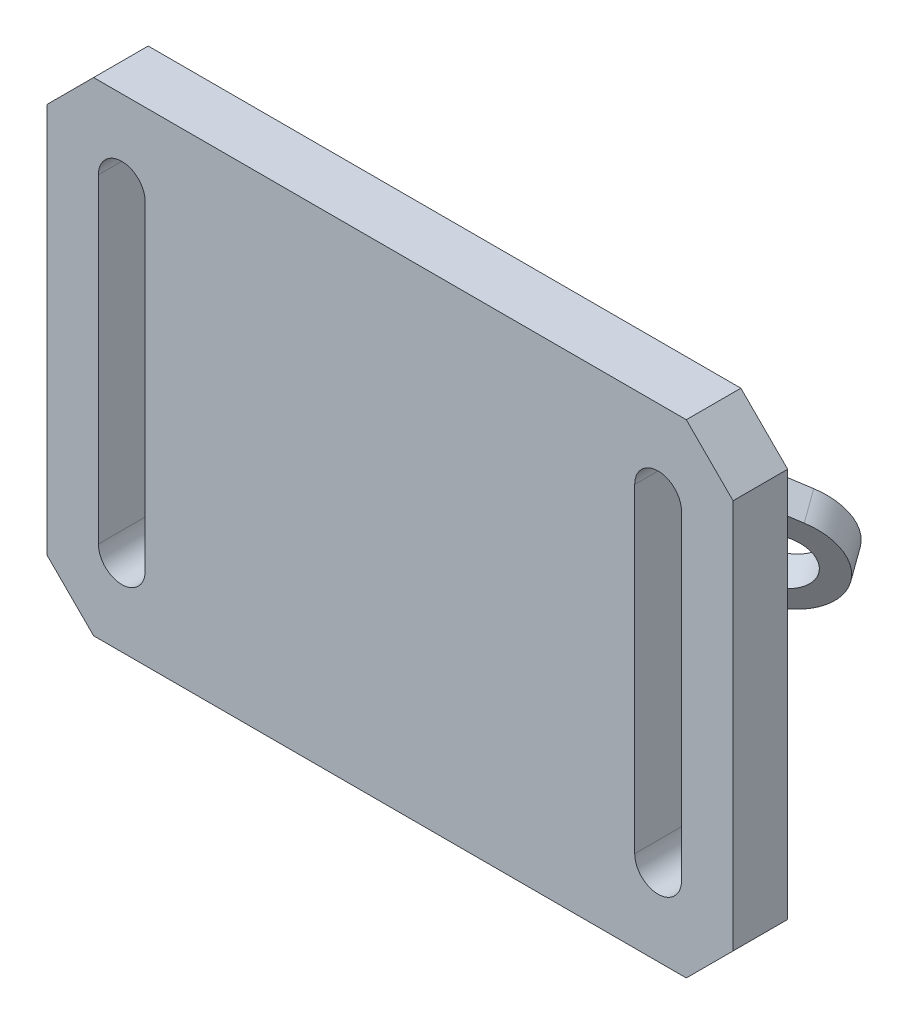
ISO-10303-21;
HEADER;
FILE_DESCRIPTION(('STEP AP214'),'2;1');
FILE_NAME('part.step','',(''),(''),'','','');
FILE_SCHEMA(('AUTOMOTIVE_DESIGN { 1 0 10303 214 1 1 1 1 }'));
ENDSEC;
DATA;
#1=APPLICATION_CONTEXT('core data for automotive mechanical design processes');
#2=APPLICATION_PROTOCOL_DEFINITION('international standard','automotive_design',2000,#1);
#3=PRODUCT_CONTEXT('',#1,'mechanical');
#4=PRODUCT('Part','Part','',(#3));
#5=PRODUCT_RELATED_PRODUCT_CATEGORY('part','',(#4));
#6=PRODUCT_DEFINITION_FORMATION('','',#4);
#7=PRODUCT_DEFINITION_CONTEXT('part definition',#1,'design');
#8=PRODUCT_DEFINITION('design','',#6,#7);
#9=PRODUCT_DEFINITION_SHAPE('','',#8);
#10=(LENGTH_UNIT() NAMED_UNIT(*) SI_UNIT(.MILLI.,.METRE.));
#11=(NAMED_UNIT(*) PLANE_ANGLE_UNIT() SI_UNIT($,.RADIAN.));
#12=(NAMED_UNIT(*) SI_UNIT($,.STERADIAN.) SOLID_ANGLE_UNIT());
#13=UNCERTAINTY_MEASURE_WITH_UNIT(LENGTH_MEASURE(1.E-05),#10,'distance_accuracy_value','');
#14=(GEOMETRIC_REPRESENTATION_CONTEXT(3) GLOBAL_UNCERTAINTY_ASSIGNED_CONTEXT((#13)) GLOBAL_UNIT_ASSIGNED_CONTEXT((#10,
#11,#12)) REPRESENTATION_CONTEXT('',''));
#15=CARTESIAN_POINT('',(0.,0.,0.));
#16=DIRECTION('',(0.,0.,1.));
#17=DIRECTION('',(1.,0.,0.));
#18=AXIS2_PLACEMENT_3D('',#15,#16,#17);
#19=CARTESIAN_POINT('',(0.,0.,0.));
#20=DIRECTION('',(0.,0.,-1.));
#21=DIRECTION('',(-1.,0.,0.));
#22=AXIS2_PLACEMENT_3D('',#19,#20,#21);
#23=PLANE('',#22);
#24=DIRECTION('',(-1.,0.,0.));
#25=VECTOR('',#24,1.);
#26=CARTESIAN_POINT('',(-38.,31.,0.));
#27=LINE('',#26,#25);
#28=CARTESIAN_POINT('',(38.,31.,0.));
#29=VERTEX_POINT('',#28);
#30=CARTESIAN_POINT('',(-38.,31.,0.));
#31=VERTEX_POINT('',#30);
#32=EDGE_CURVE('E329',#29,#31,#27,.T.);
#33=ORIENTED_EDGE('',*,*,#32,.F.);
#34=DIRECTION('',(-0.70710678118655,0.707106781186545,0.));
#35=VECTOR('',#34,1.);
#36=CARTESIAN_POINT('',(38.,31.,0.));
#37=LINE('',#36,#35);
#38=CARTESIAN_POINT('',(44.,25.,0.));
#39=VERTEX_POINT('',#38);
#40=EDGE_CURVE('E335',#39,#29,#37,.T.);
#41=ORIENTED_EDGE('',*,*,#40,.F.);
#42=DIRECTION('',(0.,1.,0.));
#43=VECTOR('',#42,1.);
#44=CARTESIAN_POINT('',(44.,25.,0.));
#45=LINE('',#44,#43);
#46=CARTESIAN_POINT('',(44.,-25.,0.));
#47=VERTEX_POINT('',#46);
#48=EDGE_CURVE('E375',#47,#39,#45,.T.);
#49=ORIENTED_EDGE('',*,*,#48,.F.);
#50=DIRECTION('',(0.707106781186549,0.707106781186546,0.));
#51=VECTOR('',#50,1.);
#52=CARTESIAN_POINT('',(38.,-31.,0.));
#53=LINE('',#52,#51);
#54=CARTESIAN_POINT('',(38.,-31.,0.));
#55=VERTEX_POINT('',#54);
#56=EDGE_CURVE('E372',#55,#47,#53,.T.);
#57=ORIENTED_EDGE('',*,*,#56,.F.);
#58=DIRECTION('',(1.,0.,0.));
#59=VECTOR('',#58,1.);
#60=CARTESIAN_POINT('',(-38.,-31.,0.));
#61=LINE('',#60,#59);
#62=CARTESIAN_POINT('',(-38.,-31.,0.));
#63=VERTEX_POINT('',#62);
#64=EDGE_CURVE('E369',#63,#55,#61,.T.);
#65=ORIENTED_EDGE('',*,*,#64,.F.);
#66=DIRECTION('',(0.707106781186545,-0.70710678118655,0.));
#67=VECTOR('',#66,1.);
#68=CARTESIAN_POINT('',(-44.,-25.,0.));
#69=LINE('',#68,#67);
#70=CARTESIAN_POINT('',(-44.,-25.,0.));
#71=VERTEX_POINT('',#70);
#72=EDGE_CURVE('E366',#71,#63,#69,.T.);
#73=ORIENTED_EDGE('',*,*,#72,.F.);
#74=DIRECTION('',(0.,-1.,0.));
#75=VECTOR('',#74,1.);
#76=CARTESIAN_POINT('',(-44.,25.,0.));
#77=LINE('',#76,#75);
#78=CARTESIAN_POINT('',(-44.,25.,0.));
#79=VERTEX_POINT('',#78);
#80=EDGE_CURVE('E363',#79,#71,#77,.T.);
#81=ORIENTED_EDGE('',*,*,#80,.F.);
#82=DIRECTION('',(-0.707106781186549,-0.707106781186546,0.));
#83=VECTOR('',#82,1.);
#84=CARTESIAN_POINT('',(-44.,25.,0.));
#85=LINE('',#84,#83);
#86=EDGE_CURVE('E360',#31,#79,#85,.T.);
#87=ORIENTED_EDGE('',*,*,#86,.F.);
#88=EDGE_LOOP('',(#33,#41,#49,#57,#65,#73,#81,#87));
#89=FACE_BOUND('',#88,.T.);
#90=DIRECTION('',(0.,1.,0.));
#91=VECTOR('',#90,1.);
#92=CARTESIAN_POINT('',(-31.3856217223385,20.5,0.));
#93=LINE('',#92,#91);
#94=CARTESIAN_POINT('',(-31.3856217223385,-20.5,0.));
#95=VERTEX_POINT('',#94);
#96=CARTESIAN_POINT('',(-31.3856217223385,20.5,0.));
#97=VERTEX_POINT('',#96);
#98=EDGE_CURVE('E291',#95,#97,#93,.T.);
#99=ORIENTED_EDGE('',*,*,#98,.T.);
#100=CARTESIAN_POINT('',(-34.3856217223385,20.5,0.));
#101=DIRECTION('',(0.,0.,1.));
#102=DIRECTION('',(1.,0.,0.));
#103=AXIS2_PLACEMENT_3D('',#100,#101,#102);
#104=CIRCLE('',#103,3.);
#105=CARTESIAN_POINT('',(-37.3856217223385,20.5,0.));
#106=VERTEX_POINT('',#105);
#107=EDGE_CURVE('E286',#97,#106,#104,.T.);
#108=ORIENTED_EDGE('',*,*,#107,.T.);
#109=DIRECTION('',(0.,-1.,0.));
#110=VECTOR('',#109,1.);
#111=CARTESIAN_POINT('',(-37.3856217223385,20.5,0.));
#112=LINE('',#111,#110);
#113=CARTESIAN_POINT('',(-37.3856217223385,-20.5,0.));
#114=VERTEX_POINT('',#113);
#115=EDGE_CURVE('E305',#106,#114,#112,.T.);
#116=ORIENTED_EDGE('',*,*,#115,.T.);
#117=CARTESIAN_POINT('',(-34.3856217223385,-20.5,0.));
#118=DIRECTION('',(0.,0.,1.));
#119=DIRECTION('',(1.,0.,0.));
#120=AXIS2_PLACEMENT_3D('',#117,#118,#119);
#121=CIRCLE('',#120,3.);
#122=EDGE_CURVE('E309',#114,#95,#121,.T.);
#123=ORIENTED_EDGE('',*,*,#122,.T.);
#124=EDGE_LOOP('',(#99,#108,#116,#123));
#125=FACE_BOUND('',#124,.T.);
#126=DIRECTION('',(0.,1.,0.));
#127=VECTOR('',#126,1.);
#128=CARTESIAN_POINT('',(37.3856217223385,20.5,0.));
#129=LINE('',#128,#127);
#130=CARTESIAN_POINT('',(37.3856217223385,-20.5,0.));
#131=VERTEX_POINT('',#130);
#132=CARTESIAN_POINT('',(37.3856217223385,20.5,0.));
#133=VERTEX_POINT('',#132);
#134=EDGE_CURVE('E248',#131,#133,#129,.T.);
#135=ORIENTED_EDGE('',*,*,#134,.T.);
#136=CARTESIAN_POINT('',(34.3856217223385,20.5,0.));
#137=DIRECTION('',(0.,0.,1.));
#138=DIRECTION('',(-1.,0.,0.));
#139=AXIS2_PLACEMENT_3D('',#136,#137,#138);
#140=CIRCLE('',#139,3.);
#141=CARTESIAN_POINT('',(31.3856217223385,20.5,0.));
#142=VERTEX_POINT('',#141);
#143=EDGE_CURVE('E213',#133,#142,#140,.T.);
#144=ORIENTED_EDGE('',*,*,#143,.T.);
#145=DIRECTION('',(0.,-1.,0.));
#146=VECTOR('',#145,1.);
#147=CARTESIAN_POINT('',(31.3856217223385,20.5,0.));
#148=LINE('',#147,#146);
#149=CARTESIAN_POINT('',(31.3856217223385,-20.5,0.));
#150=VERTEX_POINT('',#149);
#151=EDGE_CURVE('E262',#142,#150,#148,.T.);
#152=ORIENTED_EDGE('',*,*,#151,.T.);
#153=CARTESIAN_POINT('',(34.3856217223385,-20.5,0.));
#154=DIRECTION('',(0.,0.,1.));
#155=DIRECTION('',(-1.,0.,0.));
#156=AXIS2_PLACEMENT_3D('',#153,#154,#155);
#157=CIRCLE('',#156,3.);
#158=EDGE_CURVE('E266',#150,#131,#157,.T.);
#159=ORIENTED_EDGE('',*,*,#158,.T.);
#160=EDGE_LOOP('',(#135,#144,#152,#159));
#161=FACE_BOUND('',#160,.T.);
#162=DIRECTION('',(0.51208074849044,0.858937312628501,0.));
#163=VECTOR('',#162,1.);
#164=CARTESIAN_POINT('',(8.69832080368733,-13.3353650602396,0.));
#165=LINE('',#164,#163);
#166=CARTESIAN_POINT('',(8.69832080368733,-13.3353650602396,0.));
#167=VERTEX_POINT('',#166);
#168=CARTESIAN_POINT('',(15.8674512825535,-1.31024268344056,0.));
#169=VERTEX_POINT('',#168);
#170=EDGE_CURVE('E214',#167,#169,#165,.T.);
#171=ORIENTED_EDGE('',*,*,#170,.T.);
#172=DIRECTION('',(-0.8589373126285,0.51208074849044,0.));
#173=VECTOR('',#172,1.);
#174=CARTESIAN_POINT('',(-13.6223102303354,16.2709462185907,0.));
#175=LINE('',#174,#173);
#176=CARTESIAN_POINT('',(-13.6223102303354,16.2709462185907,0.));
#177=VERTEX_POINT('',#176);
#178=EDGE_CURVE('E235',#169,#177,#175,.T.);
#179=ORIENTED_EDGE('',*,*,#178,.T.);
#180=DIRECTION('',(0.51208074849044,0.858937312628501,0.));
#181=VECTOR('',#180,1.);
#182=CARTESIAN_POINT('',(-20.7914407092016,4.24582384179169,0.));
#183=LINE('',#182,#181);
#184=CARTESIAN_POINT('',(-20.7914407092016,4.24582384179169,0.));
#185=VERTEX_POINT('',#184);
#186=EDGE_CURVE('E223',#185,#177,#183,.T.);
#187=ORIENTED_EDGE('',*,*,#186,.F.);
#188=DIRECTION('',(-0.8589373126285,0.51208074849044,0.));
#189=VECTOR('',#188,1.);
#190=CARTESIAN_POINT('',(-20.7914407092016,4.24582384179169,0.));
#191=LINE('',#190,#189);
#192=EDGE_CURVE('E220',#167,#185,#191,.T.);
#193=ORIENTED_EDGE('',*,*,#192,.F.);
#194=EDGE_LOOP('',(#171,#179,#187,#193));
#195=FACE_BOUND('',#194,.T.);
#196=ADVANCED_FACE('F45',(#89,#125,#161,#195),#23,.T.);
#197=CARTESIAN_POINT('',(0.,0.,7.));
#198=DIRECTION('',(0.,0.,-1.));
#199=DIRECTION('',(-1.,0.,0.));
#200=AXIS2_PLACEMENT_3D('',#197,#198,#199);
#201=PLANE('',#200);
#202=CARTESIAN_POINT('',(-34.3856217223385,20.5,7.));
#203=DIRECTION('',(0.,0.,1.));
#204=DIRECTION('',(1.,0.,0.));
#205=AXIS2_PLACEMENT_3D('',#202,#203,#204);
#206=CIRCLE('',#205,3.);
#207=CARTESIAN_POINT('',(-31.3856217223385,20.5,7.));
#208=VERTEX_POINT('',#207);
#209=CARTESIAN_POINT('',(-37.3856217223385,20.5,7.));
#210=VERTEX_POINT('',#209);
#211=EDGE_CURVE('E287',#208,#210,#206,.T.);
#212=ORIENTED_EDGE('',*,*,#211,.F.);
#213=DIRECTION('',(0.,1.,0.));
#214=VECTOR('',#213,1.);
#215=CARTESIAN_POINT('',(-31.3856217223385,20.5,7.));
#216=LINE('',#215,#214);
#217=CARTESIAN_POINT('',(-31.3856217223385,-20.5,7.));
#218=VERTEX_POINT('',#217);
#219=EDGE_CURVE('E298',#218,#208,#216,.T.);
#220=ORIENTED_EDGE('',*,*,#219,.F.);
#221=CARTESIAN_POINT('',(-34.3856217223385,-20.5,7.));
#222=DIRECTION('',(0.,0.,1.));
#223=DIRECTION('',(1.,0.,0.));
#224=AXIS2_PLACEMENT_3D('',#221,#222,#223);
#225=CIRCLE('',#224,3.);
#226=CARTESIAN_POINT('',(-37.3856217223385,-20.5,7.));
#227=VERTEX_POINT('',#226);
#228=EDGE_CURVE('E294',#227,#218,#225,.T.);
#229=ORIENTED_EDGE('',*,*,#228,.F.);
#230=DIRECTION('',(0.,-1.,0.));
#231=VECTOR('',#230,1.);
#232=CARTESIAN_POINT('',(-37.3856217223385,20.5,7.));
#233=LINE('',#232,#231);
#234=EDGE_CURVE('E290',#210,#227,#233,.T.);
#235=ORIENTED_EDGE('',*,*,#234,.F.);
#236=EDGE_LOOP('',(#212,#220,#229,#235));
#237=FACE_BOUND('',#236,.T.);
#238=DIRECTION('',(-1.,0.,0.));
#239=VECTOR('',#238,1.);
#240=CARTESIAN_POINT('',(-38.,31.,7.));
#241=LINE('',#240,#239);
#242=CARTESIAN_POINT('',(38.,31.,7.));
#243=VERTEX_POINT('',#242);
#244=CARTESIAN_POINT('',(-38.,31.,7.));
#245=VERTEX_POINT('',#244);
#246=EDGE_CURVE('E330',#243,#245,#241,.T.);
#247=ORIENTED_EDGE('',*,*,#246,.T.);
#248=DIRECTION('',(-0.707106781186549,-0.707106781186546,0.));
#249=VECTOR('',#248,1.);
#250=CARTESIAN_POINT('',(-44.,25.,7.));
#251=LINE('',#250,#249);
#252=CARTESIAN_POINT('',(-44.,25.,7.));
#253=VERTEX_POINT('',#252);
#254=EDGE_CURVE('E334',#245,#253,#251,.T.);
#255=ORIENTED_EDGE('',*,*,#254,.T.);
#256=DIRECTION('',(0.,-1.,0.));
#257=VECTOR('',#256,1.);
#258=CARTESIAN_POINT('',(-44.,25.,7.));
#259=LINE('',#258,#257);
#260=CARTESIAN_POINT('',(-44.,-25.,7.));
#261=VERTEX_POINT('',#260);
#262=EDGE_CURVE('E338',#253,#261,#259,.T.);
#263=ORIENTED_EDGE('',*,*,#262,.T.);
#264=DIRECTION('',(0.707106781186545,-0.70710678118655,0.));
#265=VECTOR('',#264,1.);
#266=CARTESIAN_POINT('',(-44.,-25.,7.));
#267=LINE('',#266,#265);
#268=CARTESIAN_POINT('',(-38.,-31.,7.));
#269=VERTEX_POINT('',#268);
#270=EDGE_CURVE('E341',#261,#269,#267,.T.);
#271=ORIENTED_EDGE('',*,*,#270,.T.);
#272=DIRECTION('',(1.,0.,0.));
#273=VECTOR('',#272,1.);
#274=CARTESIAN_POINT('',(-38.,-31.,7.));
#275=LINE('',#274,#273);
#276=CARTESIAN_POINT('',(38.,-31.,7.));
#277=VERTEX_POINT('',#276);
#278=EDGE_CURVE('E344',#269,#277,#275,.T.);
#279=ORIENTED_EDGE('',*,*,#278,.T.);
#280=DIRECTION('',(0.707106781186549,0.707106781186546,0.));
#281=VECTOR('',#280,1.);
#282=CARTESIAN_POINT('',(38.,-31.,7.));
#283=LINE('',#282,#281);
#284=CARTESIAN_POINT('',(44.,-25.,7.));
#285=VERTEX_POINT('',#284);
#286=EDGE_CURVE('E347',#277,#285,#283,.T.);
#287=ORIENTED_EDGE('',*,*,#286,.T.);
#288=DIRECTION('',(0.,1.,0.));
#289=VECTOR('',#288,1.);
#290=CARTESIAN_POINT('',(44.,25.,7.));
#291=LINE('',#290,#289);
#292=CARTESIAN_POINT('',(44.,25.,7.));
#293=VERTEX_POINT('',#292);
#294=EDGE_CURVE('E350',#285,#293,#291,.T.);
#295=ORIENTED_EDGE('',*,*,#294,.T.);
#296=DIRECTION('',(-0.70710678118655,0.707106781186545,0.));
#297=VECTOR('',#296,1.);
#298=CARTESIAN_POINT('',(38.,31.,7.));
#299=LINE('',#298,#297);
#300=EDGE_CURVE('E353',#293,#243,#299,.T.);
#301=ORIENTED_EDGE('',*,*,#300,.T.);
#302=EDGE_LOOP('',(#247,#255,#263,#271,#279,#287,#295,#301));
#303=FACE_BOUND('',#302,.T.);
#304=CARTESIAN_POINT('',(34.3856217223385,20.5,7.));
#305=DIRECTION('',(0.,0.,1.));
#306=DIRECTION('',(-1.,0.,0.));
#307=AXIS2_PLACEMENT_3D('',#304,#305,#306);
#308=CIRCLE('',#307,3.);
#309=CARTESIAN_POINT('',(37.3856217223385,20.5,7.));
#310=VERTEX_POINT('',#309);
#311=CARTESIAN_POINT('',(31.3856217223385,20.5,7.));
#312=VERTEX_POINT('',#311);
#313=EDGE_CURVE('E244',#310,#312,#308,.T.);
#314=ORIENTED_EDGE('',*,*,#313,.F.);
#315=DIRECTION('',(0.,1.,0.));
#316=VECTOR('',#315,1.);
#317=CARTESIAN_POINT('',(37.3856217223385,20.5,7.));
#318=LINE('',#317,#316);
#319=CARTESIAN_POINT('',(37.3856217223385,-20.5,7.));
#320=VERTEX_POINT('',#319);
#321=EDGE_CURVE('E255',#320,#310,#318,.T.);
#322=ORIENTED_EDGE('',*,*,#321,.F.);
#323=CARTESIAN_POINT('',(34.3856217223385,-20.5,7.));
#324=DIRECTION('',(0.,0.,1.));
#325=DIRECTION('',(-1.,0.,0.));
#326=AXIS2_PLACEMENT_3D('',#323,#324,#325);
#327=CIRCLE('',#326,3.);
#328=CARTESIAN_POINT('',(31.3856217223385,-20.5,7.));
#329=VERTEX_POINT('',#328);
#330=EDGE_CURVE('E251',#329,#320,#327,.T.);
#331=ORIENTED_EDGE('',*,*,#330,.F.);
#332=DIRECTION('',(0.,-1.,0.));
#333=VECTOR('',#332,1.);
#334=CARTESIAN_POINT('',(31.3856217223385,20.5,7.));
#335=LINE('',#334,#333);
#336=EDGE_CURVE('E247',#312,#329,#335,.T.);
#337=ORIENTED_EDGE('',*,*,#336,.F.);
#338=EDGE_LOOP('',(#314,#322,#331,#337));
#339=FACE_BOUND('',#338,.T.);
#340=ADVANCED_FACE('F466',(#237,#303,#339),#201,.F.);
#341=CARTESIAN_POINT('',(-38.,31.,7.));
#342=DIRECTION('',(0.,-1.,0.));
#343=DIRECTION('',(0.,0.,-1.));
#344=AXIS2_PLACEMENT_3D('',#341,#342,#343);
#345=PLANE('',#344);
#346=ORIENTED_EDGE('',*,*,#32,.T.);
#347=DIRECTION('',(0.,0.,-1.));
#348=VECTOR('',#347,1.);
#349=CARTESIAN_POINT('',(-38.,31.,7.));
#350=LINE('',#349,#348);
#351=EDGE_CURVE('E407',#245,#31,#350,.T.);
#352=ORIENTED_EDGE('',*,*,#351,.F.);
#353=ORIENTED_EDGE('',*,*,#246,.F.);
#354=DIRECTION('',(0.,0.,-1.));
#355=VECTOR('',#354,1.);
#356=CARTESIAN_POINT('',(38.,31.,7.));
#357=LINE('',#356,#355);
#358=EDGE_CURVE('E356',#243,#29,#357,.T.);
#359=ORIENTED_EDGE('',*,*,#358,.T.);
#360=EDGE_LOOP('',(#346,#352,#353,#359));
#361=FACE_BOUND('',#360,.T.);
#362=ADVANCED_FACE('F473',(#361),#345,.F.);
#363=CARTESIAN_POINT('',(-44.,25.,7.));
#364=DIRECTION('',(0.707106781186546,-0.707106781186549,0.));
#365=DIRECTION('',(0.707106781186549,0.707106781186546,0.));
#366=AXIS2_PLACEMENT_3D('',#363,#364,#365);
#367=PLANE('',#366);
#368=ORIENTED_EDGE('',*,*,#86,.T.);
#369=DIRECTION('',(0.,0.,-1.));
#370=VECTOR('',#369,1.);
#371=CARTESIAN_POINT('',(-44.,25.,7.));
#372=LINE('',#371,#370);
#373=EDGE_CURVE('E403',#253,#79,#372,.T.);
#374=ORIENTED_EDGE('',*,*,#373,.F.);
#375=ORIENTED_EDGE('',*,*,#254,.F.);
#376=ORIENTED_EDGE('',*,*,#351,.T.);
#377=EDGE_LOOP('',(#368,#374,#375,#376));
#378=FACE_BOUND('',#377,.T.);
#379=ADVANCED_FACE('F504',(#378),#367,.F.);
#380=CARTESIAN_POINT('',(-44.,25.,7.));
#381=DIRECTION('',(1.,0.,0.));
#382=DIRECTION('',(0.,1.,0.));
#383=AXIS2_PLACEMENT_3D('',#380,#381,#382);
#384=PLANE('',#383);
#385=ORIENTED_EDGE('',*,*,#80,.T.);
#386=DIRECTION('',(0.,0.,-1.));
#387=VECTOR('',#386,1.);
#388=CARTESIAN_POINT('',(-44.,-25.,7.));
#389=LINE('',#388,#387);
#390=EDGE_CURVE('E399',#261,#71,#389,.T.);
#391=ORIENTED_EDGE('',*,*,#390,.F.);
#392=ORIENTED_EDGE('',*,*,#262,.F.);
#393=ORIENTED_EDGE('',*,*,#373,.T.);
#394=EDGE_LOOP('',(#385,#391,#392,#393));
#395=FACE_BOUND('',#394,.T.);
#396=ADVANCED_FACE('F500',(#395),#384,.F.);
#397=CARTESIAN_POINT('',(-44.,-25.,7.));
#398=DIRECTION('',(0.70710678118655,0.707106781186545,0.));
#399=DIRECTION('',(-0.707106781186545,0.70710678118655,0.));
#400=AXIS2_PLACEMENT_3D('',#397,#398,#399);
#401=PLANE('',#400);
#402=ORIENTED_EDGE('',*,*,#72,.T.);
#403=DIRECTION('',(0.,0.,-1.));
#404=VECTOR('',#403,1.);
#405=CARTESIAN_POINT('',(-38.,-31.,7.));
#406=LINE('',#405,#404);
#407=EDGE_CURVE('E395',#269,#63,#406,.T.);
#408=ORIENTED_EDGE('',*,*,#407,.F.);
#409=ORIENTED_EDGE('',*,*,#270,.F.);
#410=ORIENTED_EDGE('',*,*,#390,.T.);
#411=EDGE_LOOP('',(#402,#408,#409,#410));
#412=FACE_BOUND('',#411,.T.);
#413=ADVANCED_FACE('F496',(#412),#401,.F.);
#414=CARTESIAN_POINT('',(-38.,-31.,7.));
#415=DIRECTION('',(0.,1.,0.));
#416=DIRECTION('',(0.,0.,1.));
#417=AXIS2_PLACEMENT_3D('',#414,#415,#416);
#418=PLANE('',#417);
#419=ORIENTED_EDGE('',*,*,#64,.T.);
#420=DIRECTION('',(0.,0.,-1.));
#421=VECTOR('',#420,1.);
#422=CARTESIAN_POINT('',(38.,-31.,7.));
#423=LINE('',#422,#421);
#424=EDGE_CURVE('E391',#277,#55,#423,.T.);
#425=ORIENTED_EDGE('',*,*,#424,.F.);
#426=ORIENTED_EDGE('',*,*,#278,.F.);
#427=ORIENTED_EDGE('',*,*,#407,.T.);
#428=EDGE_LOOP('',(#419,#425,#426,#427));
#429=FACE_BOUND('',#428,.T.);
#430=ADVANCED_FACE('F492',(#429),#418,.F.);
#431=CARTESIAN_POINT('',(38.,-31.,7.));
#432=DIRECTION('',(-0.707106781186546,0.707106781186549,0.));
#433=DIRECTION('',(-0.707106781186549,-0.707106781186546,0.));
#434=AXIS2_PLACEMENT_3D('',#431,#432,#433);
#435=PLANE('',#434);
#436=ORIENTED_EDGE('',*,*,#56,.T.);
#437=DIRECTION('',(0.,0.,-1.));
#438=VECTOR('',#437,1.);
#439=CARTESIAN_POINT('',(44.,-25.,7.));
#440=LINE('',#439,#438);
#441=EDGE_CURVE('E387',#285,#47,#440,.T.);
#442=ORIENTED_EDGE('',*,*,#441,.F.);
#443=ORIENTED_EDGE('',*,*,#286,.F.);
#444=ORIENTED_EDGE('',*,*,#424,.T.);
#445=EDGE_LOOP('',(#436,#442,#443,#444));
#446=FACE_BOUND('',#445,.T.);
#447=ADVANCED_FACE('F488',(#446),#435,.F.);
#448=CARTESIAN_POINT('',(44.,25.,7.));
#449=DIRECTION('',(-1.,0.,0.));
#450=DIRECTION('',(0.,-1.,0.));
#451=AXIS2_PLACEMENT_3D('',#448,#449,#450);
#452=PLANE('',#451);
#453=ORIENTED_EDGE('',*,*,#48,.T.);
#454=DIRECTION('',(0.,0.,-1.));
#455=VECTOR('',#454,1.);
#456=CARTESIAN_POINT('',(44.,25.,7.));
#457=LINE('',#456,#455);
#458=EDGE_CURVE('E383',#293,#39,#457,.T.);
#459=ORIENTED_EDGE('',*,*,#458,.F.);
#460=ORIENTED_EDGE('',*,*,#294,.F.);
#461=ORIENTED_EDGE('',*,*,#441,.T.);
#462=EDGE_LOOP('',(#453,#459,#460,#461));
#463=FACE_BOUND('',#462,.T.);
#464=ADVANCED_FACE('F484',(#463),#452,.F.);
#465=CARTESIAN_POINT('',(38.,31.,7.));
#466=DIRECTION('',(-0.707106781186545,-0.70710678118655,0.));
#467=DIRECTION('',(0.70710678118655,-0.707106781186545,0.));
#468=AXIS2_PLACEMENT_3D('',#465,#466,#467);
#469=PLANE('',#468);
#470=ORIENTED_EDGE('',*,*,#40,.T.);
#471=ORIENTED_EDGE('',*,*,#358,.F.);
#472=ORIENTED_EDGE('',*,*,#300,.F.);
#473=ORIENTED_EDGE('',*,*,#458,.T.);
#474=EDGE_LOOP('',(#470,#471,#472,#473));
#475=FACE_BOUND('',#474,.T.);
#476=ADVANCED_FACE('F480',(#475),#469,.F.);
#477=CARTESIAN_POINT('',(-34.3856217223385,20.5,7.));
#478=DIRECTION('',(0.,0.,-1.));
#479=DIRECTION('',(-1.,0.,0.));
#480=AXIS2_PLACEMENT_3D('',#477,#478,#479);
#481=CYLINDRICAL_SURFACE('',#480,3.);
#482=ORIENTED_EDGE('',*,*,#107,.F.);
#483=DIRECTION('',(0.,0.,-1.));
#484=VECTOR('',#483,1.);
#485=CARTESIAN_POINT('',(-31.3856217223385,20.5,7.));
#486=LINE('',#485,#484);
#487=EDGE_CURVE('E301',#208,#97,#486,.T.);
#488=ORIENTED_EDGE('',*,*,#487,.F.);
#489=ORIENTED_EDGE('',*,*,#211,.T.);
#490=DIRECTION('',(0.,0.,-1.));
#491=VECTOR('',#490,1.);
#492=CARTESIAN_POINT('',(-37.3856217223385,20.5,7.));
#493=LINE('',#492,#491);
#494=EDGE_CURVE('E325',#210,#106,#493,.T.);
#495=ORIENTED_EDGE('',*,*,#494,.T.);
#496=EDGE_LOOP('',(#482,#488,#489,#495));
#497=FACE_BOUND('',#496,.T.);
#498=ADVANCED_FACE('F483',(#497),#481,.F.);
#499=CARTESIAN_POINT('',(-37.3856217223385,20.5,7.));
#500=DIRECTION('',(1.,0.,0.));
#501=DIRECTION('',(0.,0.,-1.));
#502=AXIS2_PLACEMENT_3D('',#499,#500,#501);
#503=PLANE('',#502);
#504=ORIENTED_EDGE('',*,*,#115,.F.);
#505=ORIENTED_EDGE('',*,*,#494,.F.);
#506=ORIENTED_EDGE('',*,*,#234,.T.);
#507=DIRECTION('',(0.,0.,-1.));
#508=VECTOR('',#507,1.);
#509=CARTESIAN_POINT('',(-37.3856217223385,-20.5,7.));
#510=LINE('',#509,#508);
#511=EDGE_CURVE('E322',#227,#114,#510,.T.);
#512=ORIENTED_EDGE('',*,*,#511,.T.);
#513=EDGE_LOOP('',(#504,#505,#506,#512));
#514=FACE_BOUND('',#513,.T.);
#515=ADVANCED_FACE('F623',(#514),#503,.T.);
#516=CARTESIAN_POINT('',(-34.3856217223385,-20.5,7.));
#517=DIRECTION('',(0.,0.,-1.));
#518=DIRECTION('',(-1.,0.,0.));
#519=AXIS2_PLACEMENT_3D('',#516,#517,#518);
#520=CYLINDRICAL_SURFACE('',#519,3.);
#521=ORIENTED_EDGE('',*,*,#122,.F.);
#522=ORIENTED_EDGE('',*,*,#511,.F.);
#523=ORIENTED_EDGE('',*,*,#228,.T.);
#524=DIRECTION('',(0.,0.,-1.));
#525=VECTOR('',#524,1.);
#526=CARTESIAN_POINT('',(-31.3856217223385,-20.5,7.));
#527=LINE('',#526,#525);
#528=EDGE_CURVE('E319',#218,#95,#527,.T.);
#529=ORIENTED_EDGE('',*,*,#528,.T.);
#530=EDGE_LOOP('',(#521,#522,#523,#529));
#531=FACE_BOUND('',#530,.T.);
#532=ADVANCED_FACE('F613',(#531),#520,.F.);
#533=CARTESIAN_POINT('',(-31.3856217223385,20.5,7.));
#534=DIRECTION('',(-1.,0.,0.));
#535=DIRECTION('',(0.,0.,1.));
#536=AXIS2_PLACEMENT_3D('',#533,#534,#535);
#537=PLANE('',#536);
#538=ORIENTED_EDGE('',*,*,#98,.F.);
#539=ORIENTED_EDGE('',*,*,#528,.F.);
#540=ORIENTED_EDGE('',*,*,#219,.T.);
#541=ORIENTED_EDGE('',*,*,#487,.T.);
#542=EDGE_LOOP('',(#538,#539,#540,#541));
#543=FACE_BOUND('',#542,.T.);
#544=ADVANCED_FACE('F603',(#543),#537,.T.);
#545=CARTESIAN_POINT('',(34.3856217223385,20.5,7.));
#546=DIRECTION('',(0.,0.,-1.));
#547=DIRECTION('',(-1.,0.,0.));
#548=AXIS2_PLACEMENT_3D('',#545,#546,#547);
#549=CYLINDRICAL_SURFACE('',#548,3.);
#550=ORIENTED_EDGE('',*,*,#143,.F.);
#551=DIRECTION('',(0.,0.,-1.));
#552=VECTOR('',#551,1.);
#553=CARTESIAN_POINT('',(37.3856217223385,20.5,7.));
#554=LINE('',#553,#552);
#555=EDGE_CURVE('E258',#310,#133,#554,.T.);
#556=ORIENTED_EDGE('',*,*,#555,.F.);
#557=ORIENTED_EDGE('',*,*,#313,.T.);
#558=DIRECTION('',(0.,0.,-1.));
#559=VECTOR('',#558,1.);
#560=CARTESIAN_POINT('',(31.3856217223385,20.5,7.));
#561=LINE('',#560,#559);
#562=EDGE_CURVE('E282',#312,#142,#561,.T.);
#563=ORIENTED_EDGE('',*,*,#562,.T.);
#564=EDGE_LOOP('',(#550,#556,#557,#563));
#565=FACE_BOUND('',#564,.T.);
#566=ADVANCED_FACE('F593',(#565),#549,.F.);
#567=CARTESIAN_POINT('',(31.3856217223385,20.5,7.));
#568=DIRECTION('',(1.,0.,0.));
#569=DIRECTION('',(0.,0.,-1.));
#570=AXIS2_PLACEMENT_3D('',#567,#568,#569);
#571=PLANE('',#570);
#572=ORIENTED_EDGE('',*,*,#151,.F.);
#573=ORIENTED_EDGE('',*,*,#562,.F.);
#574=ORIENTED_EDGE('',*,*,#336,.T.);
#575=DIRECTION('',(0.,0.,-1.));
#576=VECTOR('',#575,1.);
#577=CARTESIAN_POINT('',(31.3856217223385,-20.5,7.));
#578=LINE('',#577,#576);
#579=EDGE_CURVE('E279',#329,#150,#578,.T.);
#580=ORIENTED_EDGE('',*,*,#579,.T.);
#581=EDGE_LOOP('',(#572,#573,#574,#580));
#582=FACE_BOUND('',#581,.T.);
#583=ADVANCED_FACE('F583',(#582),#571,.T.);
#584=CARTESIAN_POINT('',(34.3856217223385,-20.5,7.));
#585=DIRECTION('',(0.,0.,-1.));
#586=DIRECTION('',(-1.,0.,0.));
#587=AXIS2_PLACEMENT_3D('',#584,#585,#586);
#588=CYLINDRICAL_SURFACE('',#587,3.);
#589=ORIENTED_EDGE('',*,*,#158,.F.);
#590=ORIENTED_EDGE('',*,*,#579,.F.);
#591=ORIENTED_EDGE('',*,*,#330,.T.);
#592=DIRECTION('',(0.,0.,-1.));
#593=VECTOR('',#592,1.);
#594=CARTESIAN_POINT('',(37.3856217223385,-20.5,7.));
#595=LINE('',#594,#593);
#596=EDGE_CURVE('E276',#320,#131,#595,.T.);
#597=ORIENTED_EDGE('',*,*,#596,.T.);
#598=EDGE_LOOP('',(#589,#590,#591,#597));
#599=FACE_BOUND('',#598,.T.);
#600=ADVANCED_FACE('F462',(#599),#588,.F.);
#601=CARTESIAN_POINT('',(37.3856217223385,20.5,7.));
#602=DIRECTION('',(-1.,0.,0.));
#603=DIRECTION('',(0.,0.,1.));
#604=AXIS2_PLACEMENT_3D('',#601,#602,#603);
#605=PLANE('',#604);
#606=ORIENTED_EDGE('',*,*,#134,.F.);
#607=ORIENTED_EDGE('',*,*,#596,.F.);
#608=ORIENTED_EDGE('',*,*,#321,.T.);
#609=ORIENTED_EDGE('',*,*,#555,.T.);
#610=EDGE_LOOP('',(#606,#607,#608,#609));
#611=FACE_BOUND('',#610,.T.);
#612=ADVANCED_FACE('F453',(#611),#605,.T.);
#613=CARTESIAN_POINT('',(8.69832080368733,-13.3353650602396,-24.9442719099991));
#614=DIRECTION('',(0.504870685006757,-0.300993511945569,0.809016994374952));
#615=DIRECTION('',(0.848358617720962,0.,-0.529422001562628));
#616=AXIS2_PLACEMENT_3D('',#613,#614,#615);
#617=PLANE('',#616);
#618=CARTESIAN_POINT('',(15.822562367247,-9.43308604822587,-27.9383499958396));
#619=DIRECTION('',(-0.504870685006757,0.300993511945569,-0.809016994374951));
#620=DIRECTION('',(-0.848358617720962,0.,0.529422001562628));
#621=AXIS2_PLACEMENT_3D('',#618,#619,#620);
#622=CIRCLE('',#621,4.);
#623=CARTESIAN_POINT('',(12.4291278963632,-9.43308604822587,-25.8206619895891));
#624=VERTEX_POINT('',#623);
#625=EDGE_CURVE('E441',#624,#624,#622,.T.);
#626=ORIENTED_EDGE('',*,*,#625,.F.);
#627=EDGE_LOOP('',(#626));
#628=FACE_BOUND('',#627,.T.);
#629=DIRECTION('',(0.694894883019208,-0.414282028021011,-0.587785252292468));
#630=VECTOR('',#629,1.);
#631=CARTESIAN_POINT('',(15.8674512825535,-1.31024268344056,-24.9442719099991));
#632=LINE('',#631,#630);
#633=CARTESIAN_POINT('',(19.4071276066801,-3.42052485982637,-27.9383499958395));
#634=VERTEX_POINT('',#633);
#635=EDGE_CURVE('E227',#177,#634,#632,.T.);
#636=ORIENTED_EDGE('',*,*,#635,.T.);
#637=CARTESIAN_POINT('',(15.822562367247,-9.43308604822588,-27.9383499958395));
#638=DIRECTION('',(0.504870685006757,-0.300993511945569,0.809016994374952));
#639=DIRECTION('',(0.848358617720962,0.,-0.529422001562628));
#640=AXIS2_PLACEMENT_3D('',#637,#638,#639);
#641=CIRCLE('',#640,7.);
#642=CARTESIAN_POINT('',(20.6868265483815,-12.333060244373,-32.0528467618868));
#643=VERTEX_POINT('',#642);
#644=EDGE_CURVE('E55',#634,#643,#641,.F.);
#645=ORIENTED_EDGE('',*,*,#644,.T.);
#646=CARTESIAN_POINT('',(15.822562367247,-9.43308604822587,-27.9383499958395));
#647=DIRECTION('',(0.504870685006757,-0.300993511945569,0.809016994374952));
#648=DIRECTION('',(0.848358617720962,0.,-0.529422001562628));
#649=AXIS2_PLACEMENT_3D('',#646,#647,#648);
#650=CIRCLE('',#649,7.);
#651=CARTESIAN_POINT('',(12.237997127814,-15.4456472366254,-27.9383499958396));
#652=VERTEX_POINT('',#651);
#653=EDGE_CURVE('E62',#643,#652,#650,.F.);
#654=ORIENTED_EDGE('',*,*,#653,.T.);
#655=DIRECTION('',(0.694894883019207,-0.414282028021011,-0.587785252292468));
#656=VECTOR('',#655,1.);
#657=CARTESIAN_POINT('',(8.69832080368733,-13.3353650602396,-24.9442719099991));
#658=LINE('',#657,#656);
#659=EDGE_CURVE('E202',#185,#652,#658,.T.);
#660=ORIENTED_EDGE('',*,*,#659,.F.);
#661=ORIENTED_EDGE('',*,*,#186,.T.);
#662=EDGE_LOOP('',(#636,#645,#654,#660,#661));
#663=FACE_BOUND('',#662,.T.);
#664=ADVANCED_FACE('F429',(#628,#663),#617,.F.);
#665=CARTESIAN_POINT('',(8.69832080368733,-13.3353650602396,-20.));
#666=DIRECTION('',(-0.504870685006757,0.300993511945569,-0.809016994374951));
#667=DIRECTION('',(-0.848358617720962,0.,0.529422001562628));
#668=AXIS2_PLACEMENT_3D('',#665,#666,#667);
#669=PLANE('',#668);
#670=CARTESIAN_POINT('',(17.8420451072741,-10.6370600960082,-24.7022820183397));
#671=DIRECTION('',(-0.504870685006757,0.300993511945569,-0.809016994374951));
#672=DIRECTION('',(-0.848358617720962,0.,0.529422001562628));
#673=AXIS2_PLACEMENT_3D('',#670,#671,#672);
#674=CIRCLE('',#673,4.);
#675=CARTESIAN_POINT('',(14.4486106363902,-10.6370600960082,-22.5845940120892));
#676=VERTEX_POINT('',#675);
#677=EDGE_CURVE('E438',#676,#676,#674,.F.);
#678=ORIENTED_EDGE('',*,*,#677,.F.);
#679=EDGE_LOOP('',(#678));
#680=FACE_BOUND('',#679,.T.);
#681=CARTESIAN_POINT('',(17.8420451072741,-10.6370600960082,-24.7022820183397));
#682=DIRECTION('',(-0.504870685006757,0.300993511945569,-0.809016994374951));
#683=DIRECTION('',(-0.848358617720962,0.,0.529422001562628));
#684=AXIS2_PLACEMENT_3D('',#681,#682,#683);
#685=CIRCLE('',#684,7.);
#686=CARTESIAN_POINT('',(14.257479867841,-16.6496212844077,-24.7022820183397));
#687=VERTEX_POINT('',#686);
#688=CARTESIAN_POINT('',(22.7063092884085,-13.5370342921552,-28.816778784387));
#689=VERTEX_POINT('',#688);
#690=EDGE_CURVE('E411',#687,#689,#685,.F.);
#691=ORIENTED_EDGE('',*,*,#690,.T.);
#692=CARTESIAN_POINT('',(17.8420451072741,-10.6370600960082,-24.7022820183397));
#693=DIRECTION('',(-0.504870685006757,0.300993511945569,-0.809016994374951));
#694=DIRECTION('',(-0.848358617720962,0.,0.529422001562628));
#695=AXIS2_PLACEMENT_3D('',#692,#693,#694);
#696=CIRCLE('',#695,7.);
#697=CARTESIAN_POINT('',(21.4266103467072,-4.62449890760865,-24.7022820183397));
#698=VERTEX_POINT('',#697);
#699=EDGE_CURVE('E414',#689,#698,#696,.F.);
#700=ORIENTED_EDGE('',*,*,#699,.T.);
#701=DIRECTION('',(-0.694894883019207,0.414282028021011,0.587785252292468));
#702=VECTOR('',#701,1.);
#703=CARTESIAN_POINT('',(15.8674512825535,-1.31024268344056,-20.));
#704=LINE('',#703,#702);
#705=CARTESIAN_POINT('',(15.8674512825535,-1.31024268344056,-20.));
#706=VERTEX_POINT('',#705);
#707=EDGE_CURVE('E208',#698,#706,#704,.T.);
#708=ORIENTED_EDGE('',*,*,#707,.T.);
#709=DIRECTION('',(0.51208074849044,0.858937312628501,0.));
#710=VECTOR('',#709,1.);
#711=CARTESIAN_POINT('',(8.69832080368733,-13.3353650602396,-20.));
#712=LINE('',#711,#710);
#713=CARTESIAN_POINT('',(8.69832080368733,-13.3353650602396,-20.));
#714=VERTEX_POINT('',#713);
#715=EDGE_CURVE('E205',#714,#706,#712,.T.);
#716=ORIENTED_EDGE('',*,*,#715,.F.);
#717=DIRECTION('',(-0.694894883019207,0.414282028021011,0.587785252292468));
#718=VECTOR('',#717,1.);
#719=CARTESIAN_POINT('',(8.69832080368733,-13.3353650602396,-20.));
#720=LINE('',#719,#718);
#721=EDGE_CURVE('E192',#687,#714,#720,.T.);
#722=ORIENTED_EDGE('',*,*,#721,.F.);
#723=EDGE_LOOP('',(#691,#700,#708,#716,#722));
#724=FACE_BOUND('',#723,.T.);
#725=ADVANCED_FACE('F206',(#680,#724),#669,.F.);
#726=CARTESIAN_POINT('',(8.69832080368733,-13.3353650602396,0.));
#727=DIRECTION('',(-0.858937312628501,0.51208074849044,0.));
#728=DIRECTION('',(-0.51208074849044,-0.858937312628501,0.));
#729=AXIS2_PLACEMENT_3D('',#726,#727,#728);
#730=PLANE('',#729);
#731=DIRECTION('',(0.,0.,1.));
#732=VECTOR('',#731,1.);
#733=CARTESIAN_POINT('',(15.8674512825535,-1.31024268344056,0.));
#734=LINE('',#733,#732);
#735=EDGE_CURVE('E232',#706,#169,#734,.T.);
#736=ORIENTED_EDGE('',*,*,#735,.T.);
#737=ORIENTED_EDGE('',*,*,#170,.F.);
#738=DIRECTION('',(0.,0.,1.));
#739=VECTOR('',#738,1.);
#740=CARTESIAN_POINT('',(8.69832080368733,-13.3353650602396,0.));
#741=LINE('',#740,#739);
#742=EDGE_CURVE('E196',#714,#167,#741,.T.);
#743=ORIENTED_EDGE('',*,*,#742,.F.);
#744=ORIENTED_EDGE('',*,*,#715,.T.);
#745=EDGE_LOOP('',(#736,#737,#743,#744));
#746=FACE_BOUND('',#745,.T.);
#747=ADVANCED_FACE('F216',(#746),#730,.F.);
#748=CARTESIAN_POINT('',(-3.58456523943308,-6.0125611883995,0.));
#749=DIRECTION('',(-0.51208074849044,-0.8589373126285,0.));
#750=DIRECTION('',(0.8589373126285,-0.51208074849044,0.));
#751=AXIS2_PLACEMENT_3D('',#748,#749,#750);
#752=PLANE('',#751);
#753=ORIENTED_EDGE('',*,*,#659,.T.);
#754=DIRECTION('',(0.504870685006758,-0.300993511945569,0.809016994374951));
#755=VECTOR('',#754,1.);
#756=CARTESIAN_POINT('',(14.257479867841,-16.6496212844077,-24.7022820183397));
#757=LINE('',#756,#755);
#758=EDGE_CURVE('E11',#652,#687,#757,.T.);
#759=ORIENTED_EDGE('',*,*,#758,.T.);
#760=ORIENTED_EDGE('',*,*,#721,.T.);
#761=ORIENTED_EDGE('',*,*,#742,.T.);
#762=ORIENTED_EDGE('',*,*,#192,.T.);
#763=EDGE_LOOP('',(#753,#759,#760,#761,#762));
#764=FACE_BOUND('',#763,.T.);
#765=ADVANCED_FACE('F194',(#764),#752,.T.);
#766=CARTESIAN_POINT('',(3.58456523943308,6.0125611883995,0.));
#767=DIRECTION('',(-0.51208074849044,-0.8589373126285,0.));
#768=DIRECTION('',(0.8589373126285,-0.51208074849044,0.));
#769=AXIS2_PLACEMENT_3D('',#766,#767,#768);
#770=PLANE('',#769);
#771=ORIENTED_EDGE('',*,*,#707,.F.);
#772=DIRECTION('',(0.504870685006758,-0.300993511945569,0.809016994374951));
#773=VECTOR('',#772,1.);
#774=CARTESIAN_POINT('',(25.3519568714383,-6.96470972033659,-18.412211824869));
#775=LINE('',#774,#773);
#776=EDGE_CURVE('E417',#698,#634,#775,.F.);
#777=ORIENTED_EDGE('',*,*,#776,.T.);
#778=ORIENTED_EDGE('',*,*,#635,.F.);
#779=ORIENTED_EDGE('',*,*,#178,.F.);
#780=ORIENTED_EDGE('',*,*,#735,.F.);
#781=EDGE_LOOP('',(#771,#777,#778,#779,#780));
#782=FACE_BOUND('',#781,.T.);
#783=ADVANCED_FACE('F426',(#782),#770,.F.);
#784=CARTESIAN_POINT('',(21.7673916320053,-12.9772709087361,-18.412211824869));
#785=DIRECTION('',(-0.504870685006758,0.300993511945569,-0.809016994374951));
#786=DIRECTION('',(-0.848358617720961,0.,0.529422001562628));
#787=AXIS2_PLACEMENT_3D('',#784,#785,#786);
#788=CYLINDRICAL_SURFACE('',#787,7.);
#789=ORIENTED_EDGE('',*,*,#758,.F.);
#790=ORIENTED_EDGE('',*,*,#653,.F.);
#791=DIRECTION('',(0.504870685006758,-0.300993511945569,0.809016994374951));
#792=VECTOR('',#791,1.);
#793=CARTESIAN_POINT('',(20.6868265483815,-12.333060244373,-32.0528467618868));
#794=LINE('',#793,#792);
#795=EDGE_CURVE('E49',#689,#643,#794,.F.);
#796=ORIENTED_EDGE('',*,*,#795,.F.);
#797=ORIENTED_EDGE('',*,*,#690,.F.);
#798=EDGE_LOOP('',(#789,#790,#796,#797));
#799=FACE_BOUND('',#798,.T.);
#800=ADVANCED_FACE('F47',(#799),#788,.T.);
#801=CARTESIAN_POINT('',(17.8420451072741,-10.6370600960082,-24.7022820183397));
#802=DIRECTION('',(0.504870685006758,-0.300993511945569,0.809016994374951));
#803=DIRECTION('',(0.848358617720961,0.,-0.529422001562628));
#804=AXIS2_PLACEMENT_3D('',#801,#802,#803);
#805=CYLINDRICAL_SURFACE('',#804,7.);
#806=ORIENTED_EDGE('',*,*,#644,.F.);
#807=ORIENTED_EDGE('',*,*,#776,.F.);
#808=ORIENTED_EDGE('',*,*,#699,.F.);
#809=ORIENTED_EDGE('',*,*,#795,.T.);
#810=EDGE_LOOP('',(#806,#807,#808,#809));
#811=FACE_BOUND('',#810,.T.);
#812=ADVANCED_FACE('F436',(#811),#805,.T.);
#813=CARTESIAN_POINT('',(40.5535504819034,-24.1771921878305,11.691183400765));
#814=DIRECTION('',(-0.504870685006757,0.300993511945569,-0.809016994374951));
#815=DIRECTION('',(-0.848358617720962,0.,0.529422001562628));
#816=AXIS2_PLACEMENT_3D('',#813,#814,#815);
#817=CYLINDRICAL_SURFACE('',#816,4.);
#818=CARTESIAN_POINT('',(12.4291278963632,-9.43308604822587,-25.8206619895891));
#819=CARTESIAN_POINT('',(12.4501641749051,-9.44562744455694,-25.7869529481568));
#820=CARTESIAN_POINT('',(12.4712004534471,-9.458168840888,-25.7532439067245));
#821=CARTESIAN_POINT('',(12.513273010531,-9.48325163355013,-25.6858258238599));
#822=CARTESIAN_POINT('',(12.5343092890729,-9.4957930298812,-25.6521167824276));
#823=CARTESIAN_POINT('',(12.5763818461568,-9.52087582254333,-25.584698699563));
#824=CARTESIAN_POINT('',(12.5974181246988,-9.53341721887439,-25.5509896581307));
#825=CARTESIAN_POINT('',(12.6394906817827,-9.55850001153653,-25.4835715752662));
#826=CARTESIAN_POINT('',(12.6605269603246,-9.57104140786759,-25.4498625338339));
#827=CARTESIAN_POINT('',(12.7025995174085,-9.59612420052972,-25.3824444509693));
#828=CARTESIAN_POINT('',(12.7236357959505,-9.60866559686079,-25.348735409537));
#829=CARTESIAN_POINT('',(12.7657083530344,-9.63374838952292,-25.2813173266724));
#830=CARTESIAN_POINT('',(12.7867446315763,-9.64628978585398,-25.2476082852401));
#831=CARTESIAN_POINT('',(12.8288171886602,-9.67137257851611,-25.1801902023755));
#832=CARTESIAN_POINT('',(12.8498534672022,-9.68391397484718,-25.1464811609433));
#833=CARTESIAN_POINT('',(12.8919260242861,-9.70899676750931,-25.0790630780787));
#834=CARTESIAN_POINT('',(12.912962302828,-9.72153816384038,-25.0453540366464));
#835=CARTESIAN_POINT('',(12.9550348599119,-9.74662095650251,-24.9779359537818));
#836=CARTESIAN_POINT('',(12.9760711384539,-9.75916235283357,-24.9442269123495));
#837=CARTESIAN_POINT('',(13.0181436955377,-9.7842451454957,-24.8768088294849));
#838=CARTESIAN_POINT('',(13.0391799740797,-9.79678654182677,-24.8430997880526));
#839=CARTESIAN_POINT('',(13.0812525311636,-9.8218693344889,-24.7756817051881));
#840=CARTESIAN_POINT('',(13.1022888097055,-9.83441073081997,-24.7419726637558));
#841=CARTESIAN_POINT('',(13.1443613667894,-9.8594935234821,-24.6745545808912));
#842=CARTESIAN_POINT('',(13.1653976453314,-9.87203491981316,-24.6408455394589));
#843=CARTESIAN_POINT('',(13.2074702024153,-9.89711771247529,-24.5734274565943));
#844=CARTESIAN_POINT('',(13.2285064809572,-9.90965910880636,-24.539718415162));
#845=CARTESIAN_POINT('',(13.2705790380411,-9.93474190146849,-24.4723003322975));
#846=CARTESIAN_POINT('',(13.2916153165831,-9.94728329779955,-24.4385912908652));
#847=CARTESIAN_POINT('',(13.333687873667,-9.97236609046169,-24.3711732080006));
#848=CARTESIAN_POINT('',(13.3547241522089,-9.98490748679275,-24.3374641665683));
#849=CARTESIAN_POINT('',(13.3967967092928,-10.0099902794549,-24.2700460837037));
#850=CARTESIAN_POINT('',(13.4178329878348,-10.0225316757859,-24.2363370422714));
#851=CARTESIAN_POINT('',(13.4599055449187,-10.0476144684481,-24.1689189594068));
#852=CARTESIAN_POINT('',(13.4809418234606,-10.0601558647791,-24.1352099179746));
#853=CARTESIAN_POINT('',(13.5230143805445,-10.0852386574413,-24.06779183511));
#854=CARTESIAN_POINT('',(13.5440506590865,-10.0977800537723,-24.0340827936777));
#855=CARTESIAN_POINT('',(13.5861232161704,-10.1228628464345,-23.9666647108131));
#856=CARTESIAN_POINT('',(13.6071594947123,-10.1354042427655,-23.9329556693808));
#857=CARTESIAN_POINT('',(13.6492320517962,-10.1604870354277,-23.8655375865162));
#858=CARTESIAN_POINT('',(13.6702683303381,-10.1730284317587,-23.831828545084));
#859=CARTESIAN_POINT('',(13.712340887422,-10.1981112244209,-23.7644104622194));
#860=CARTESIAN_POINT('',(13.733377165964,-10.2106526207519,-23.7307014207871));
#861=CARTESIAN_POINT('',(13.7754497230479,-10.2357354134141,-23.6632833379225));
#862=CARTESIAN_POINT('',(13.7964860015898,-10.2482768097451,-23.6295742964902));
#863=CARTESIAN_POINT('',(13.8385585586737,-10.2733596024073,-23.5621562136256));
#864=CARTESIAN_POINT('',(13.8595948372157,-10.2859009987383,-23.5284471721933));
#865=CARTESIAN_POINT('',(13.9016673942996,-10.3109837914005,-23.4610290893288));
#866=CARTESIAN_POINT('',(13.9227036728415,-10.3235251877315,-23.4273200478965));
#867=CARTESIAN_POINT('',(13.9647762299254,-10.3486079803936,-23.3599019650319));
#868=CARTESIAN_POINT('',(13.9858125084674,-10.3611493767247,-23.3261929235996));
#869=CARTESIAN_POINT('',(14.0278850655513,-10.3862321693868,-23.258774840735));
#870=CARTESIAN_POINT('',(14.0489213440932,-10.3987735657179,-23.2250657993027));
#871=CARTESIAN_POINT('',(14.0909939011771,-10.42385635838,-23.1576477164382));
#872=CARTESIAN_POINT('',(14.1120301797191,-10.4363977547111,-23.1239386750059));
#873=CARTESIAN_POINT('',(14.154102736803,-10.4614805473732,-23.0565205921413));
#874=CARTESIAN_POINT('',(14.1751390153449,-10.4740219437043,-23.022811550709));
#875=CARTESIAN_POINT('',(14.2172115724288,-10.4991047363664,-22.9553934678444));
#876=CARTESIAN_POINT('',(14.2382478509708,-10.5116461326975,-22.9216844264121));
#877=CARTESIAN_POINT('',(14.2803204080546,-10.5367289253596,-22.8542663435475));
#878=CARTESIAN_POINT('',(14.3013566865966,-10.5492703216907,-22.8205573021153));
#879=CARTESIAN_POINT('',(14.3434292436805,-10.5743531143528,-22.7531392192507));
#880=CARTESIAN_POINT('',(14.3644655222224,-10.5868945106839,-22.7194301778184));
#881=CARTESIAN_POINT('',(14.4065380793063,-10.611977303346,-22.6520120949538));
#882=CARTESIAN_POINT('',(14.4275743578483,-10.6245186996771,-22.6183030535215));
#883=CARTESIAN_POINT('',(14.4486106363902,-10.6370600960082,-22.5845940120892));
#884=B_SPLINE_CURVE_WITH_KNOTS('',3,(#818,#819,#820,#821,#822,#823,#824,#825,#826,#827,#828,
#829,#830,#831,#832,#833,#834,#835,#836,#837,#838,#839,#840,#841,#842,#843,#844,#845,#846,#847,
#848,#849,#850,#851,#852,#853,#854,#855,#856,#857,#858,#859,#860,#861,#862,#863,#864,#865,#866,
#867,#868,#869,#870,#871,#872,#873,#874,#875,#876,#877,#878,#879,#880,#881,#882,#883),
.UNSPECIFIED.,.F.,.F.,(4,2,2,2,2,2,2,2,2,2,2,2,2,2,2,2,2,2,2,2,2,2,2,2,2,2,2,2,2,2,2,2,4),(0.,
0.125000000000002,0.250000000000004,0.375,0.500000000000001,0.625000000000003,0.750000000000005,
0.875000000000002,1.,1.12500000000001,1.25000000000001,1.37500000000001,1.50000000000001,
1.62500000000001,1.75000000000001,1.87500000000001,2.00000000000001,2.12500000000001,
2.25000000000001,2.37500000000001,2.50000000000001,2.62500000000001,2.75000000000001,
2.87500000000001,3.00000000000002,3.12500000000002,3.25000000000002,3.37500000000001,
3.50000000000002,3.62500000000002,3.75000000000002,3.87500000000001,4.00000000000002),.UNSPECIFIED.);
#885=EDGE_CURVE('BSEAM450',#624,#676,#884,.T.);
#886=ORIENTED_EDGE('',*,*,#625,.T.);
#887=ORIENTED_EDGE('',*,*,#677,.T.);
#888=ORIENTED_EDGE('',*,*,#885,.T.);
#889=ORIENTED_EDGE('',*,*,#885,.F.);
#890=EDGE_LOOP('',(#886,#888,#887,#889));
#891=FACE_BOUND('',#890,.T.);
#892=ADVANCED_FACE('F450',(#891),#817,.F.);
#893=CLOSED_SHELL('',(#196,#340,#362,#379,#396,#413,#430,#447,#464,#476,#498,#515,#532,#544,
#566,#583,#600,#612,#664,#725,#747,#765,#783,#800,#812,#892));
#894=MANIFOLD_SOLID_BREP('B2',#893);
#895=ADVANCED_BREP_SHAPE_REPRESENTATION('',(#18,#894),#14);
#896=SHAPE_DEFINITION_REPRESENTATION(#9,#895);
ENDSEC;
END-ISO-10303-21;
